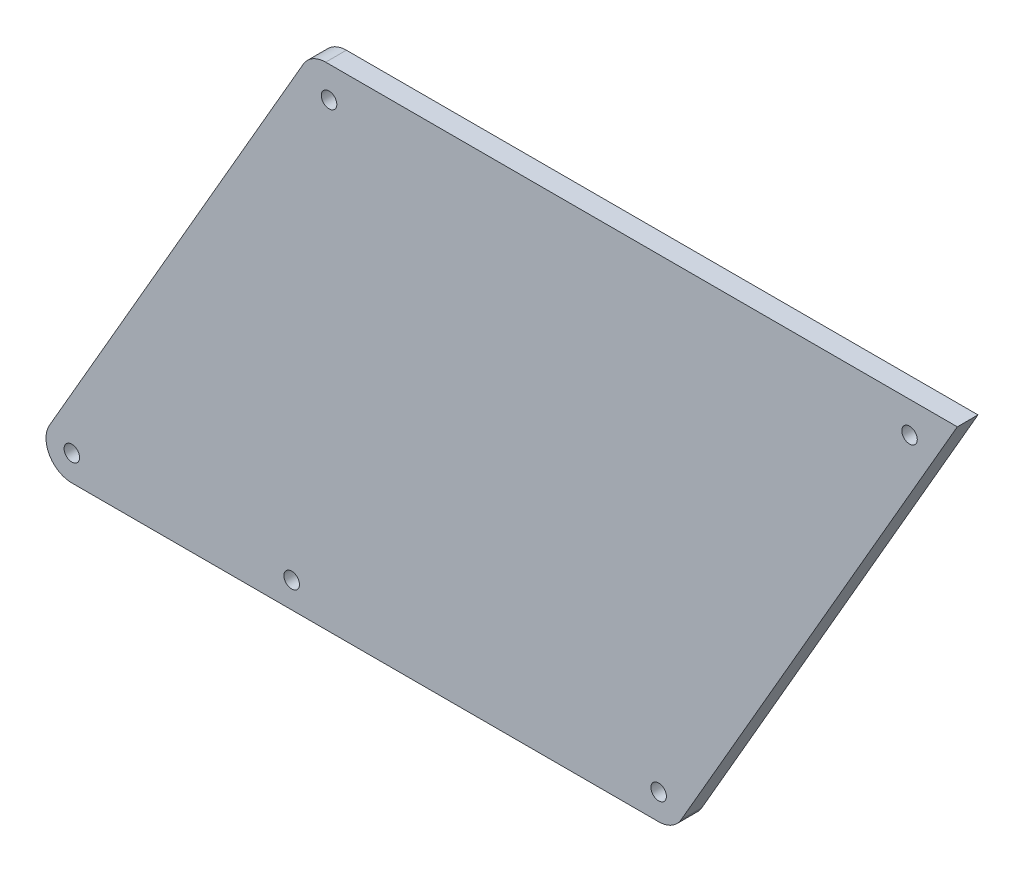
ISO-10303-21;
HEADER;
FILE_DESCRIPTION(('STEP AP214'),'2;1');
FILE_NAME('part.step','',(''),(''),'','','');
FILE_SCHEMA(('AUTOMOTIVE_DESIGN { 1 0 10303 214 1 1 1 1 }'));
ENDSEC;
DATA;
#1=APPLICATION_CONTEXT('core data for automotive mechanical design processes');
#2=APPLICATION_PROTOCOL_DEFINITION('international standard','automotive_design',2000,#1);
#3=PRODUCT_CONTEXT('',#1,'mechanical');
#4=PRODUCT('Part','Part','',(#3));
#5=PRODUCT_RELATED_PRODUCT_CATEGORY('part','',(#4));
#6=PRODUCT_DEFINITION_FORMATION('','',#4);
#7=PRODUCT_DEFINITION_CONTEXT('part definition',#1,'design');
#8=PRODUCT_DEFINITION('design','',#6,#7);
#9=PRODUCT_DEFINITION_SHAPE('','',#8);
#10=(LENGTH_UNIT() NAMED_UNIT(*) SI_UNIT(.MILLI.,.METRE.));
#11=(NAMED_UNIT(*) PLANE_ANGLE_UNIT() SI_UNIT($,.RADIAN.));
#12=(NAMED_UNIT(*) SI_UNIT($,.STERADIAN.) SOLID_ANGLE_UNIT());
#13=UNCERTAINTY_MEASURE_WITH_UNIT(LENGTH_MEASURE(1.E-05),#10,'distance_accuracy_value','');
#14=(GEOMETRIC_REPRESENTATION_CONTEXT(3) GLOBAL_UNCERTAINTY_ASSIGNED_CONTEXT((#13)) GLOBAL_UNIT_ASSIGNED_CONTEXT((#10,
#11,#12)) REPRESENTATION_CONTEXT('',''));
#15=CARTESIAN_POINT('',(0.,0.,0.));
#16=DIRECTION('',(0.,0.,1.));
#17=DIRECTION('',(1.,0.,0.));
#18=AXIS2_PLACEMENT_3D('',#15,#16,#17);
#19=CARTESIAN_POINT('',(5.77350269189623,-10.,8.));
#20=DIRECTION('',(0.,0.,-1.));
#21=DIRECTION('',(-1.,0.,0.));
#22=AXIS2_PLACEMENT_3D('',#19,#20,#21);
#23=CYLINDRICAL_SURFACE('',#22,10.);
#24=CARTESIAN_POINT('',(5.77350269189623,-10.,0.));
#25=DIRECTION('',(0.,0.,1.));
#26=DIRECTION('',(-1.,0.,0.));
#27=AXIS2_PLACEMENT_3D('',#24,#25,#26);
#28=CIRCLE('',#27,10.);
#29=CARTESIAN_POINT('',(5.77350269189623,0.,0.));
#30=VERTEX_POINT('',#29);
#31=CARTESIAN_POINT('',(-2.88675134594814,-4.99999999999996,0.));
#32=VERTEX_POINT('',#31);
#33=EDGE_CURVE('E129',#30,#32,#28,.T.);
#34=ORIENTED_EDGE('',*,*,#33,.T.);
#35=DIRECTION('',(0.,0.,-1.));
#36=VECTOR('',#35,1.);
#37=CARTESIAN_POINT('',(-2.88675134594814,-4.99999999999996,8.));
#38=LINE('',#37,#36);
#39=CARTESIAN_POINT('',(-2.88675134594814,-4.99999999999996,8.));
#40=VERTEX_POINT('',#39);
#41=EDGE_CURVE('E11',#40,#32,#38,.T.);
#42=ORIENTED_EDGE('',*,*,#41,.F.);
#43=CARTESIAN_POINT('',(5.77350269189623,-10.,8.));
#44=DIRECTION('',(0.,0.,1.));
#45=DIRECTION('',(-1.,0.,0.));
#46=AXIS2_PLACEMENT_3D('',#43,#44,#45);
#47=CIRCLE('',#46,10.);
#48=CARTESIAN_POINT('',(5.77350269189623,0.,8.));
#49=VERTEX_POINT('',#48);
#50=EDGE_CURVE('E142',#49,#40,#47,.T.);
#51=ORIENTED_EDGE('',*,*,#50,.F.);
#52=DIRECTION('',(0.,0.,-1.));
#53=VECTOR('',#52,1.);
#54=CARTESIAN_POINT('',(5.77350269189623,0.,8.));
#55=LINE('',#54,#53);
#56=EDGE_CURVE('E125',#49,#30,#55,.T.);
#57=ORIENTED_EDGE('',*,*,#56,.T.);
#58=EDGE_LOOP('',(#34,#42,#51,#57));
#59=FACE_BOUND('',#58,.T.);
#60=ADVANCED_FACE('F39',(#59),#23,.T.);
#61=CARTESIAN_POINT('',(-2.88675134594814,-4.99999999999996,8.));
#62=DIRECTION('',(0.866025403784436,-0.500000000000004,0.));
#63=DIRECTION('',(0.500000000000004,0.866025403784436,0.));
#64=AXIS2_PLACEMENT_3D('',#61,#62,#63);
#65=PLANE('',#64);
#66=DIRECTION('',(-0.500000000000004,-0.866025403784436,0.));
#67=VECTOR('',#66,1.);
#68=CARTESIAN_POINT('',(-2.88675134594814,-4.99999999999996,0.));
#69=LINE('',#68,#67);
#70=CARTESIAN_POINT('',(-101.036297108186,-175.,0.));
#71=VERTEX_POINT('',#70);
#72=EDGE_CURVE('E132',#32,#71,#69,.T.);
#73=ORIENTED_EDGE('',*,*,#72,.T.);
#74=DIRECTION('',(0.,0.,-1.));
#75=VECTOR('',#74,1.);
#76=CARTESIAN_POINT('',(-101.036297108186,-175.,8.));
#77=LINE('',#76,#75);
#78=CARTESIAN_POINT('',(-101.036297108186,-175.,8.));
#79=VERTEX_POINT('',#78);
#80=EDGE_CURVE('E47',#79,#71,#77,.T.);
#81=ORIENTED_EDGE('',*,*,#80,.F.);
#82=DIRECTION('',(-0.500000000000004,-0.866025403784436,0.));
#83=VECTOR('',#82,1.);
#84=CARTESIAN_POINT('',(-2.88675134594814,-4.99999999999996,8.));
#85=LINE('',#84,#83);
#86=EDGE_CURVE('E95',#40,#79,#85,.T.);
#87=ORIENTED_EDGE('',*,*,#86,.F.);
#88=ORIENTED_EDGE('',*,*,#41,.T.);
#89=EDGE_LOOP('',(#73,#81,#87,#88));
#90=FACE_BOUND('',#89,.T.);
#91=ADVANCED_FACE('F220',(#90),#65,.F.);
#92=CARTESIAN_POINT('',(-92.3760430703412,-180.,8.));
#93=DIRECTION('',(0.,0.,-1.));
#94=DIRECTION('',(-1.,0.,0.));
#95=AXIS2_PLACEMENT_3D('',#92,#93,#94);
#96=CYLINDRICAL_SURFACE('',#95,10.);
#97=CARTESIAN_POINT('',(-92.3760430703412,-180.,0.));
#98=DIRECTION('',(0.,0.,1.));
#99=DIRECTION('',(1.,0.,0.));
#100=AXIS2_PLACEMENT_3D('',#97,#98,#99);
#101=CIRCLE('',#100,10.);
#102=CARTESIAN_POINT('',(-92.3760430703412,-190.,0.));
#103=VERTEX_POINT('',#102);
#104=EDGE_CURVE('E135',#71,#103,#101,.T.);
#105=ORIENTED_EDGE('',*,*,#104,.T.);
#106=DIRECTION('',(0.,0.,-1.));
#107=VECTOR('',#106,1.);
#108=CARTESIAN_POINT('',(-92.3760430703412,-190.,8.));
#109=LINE('',#108,#107);
#110=CARTESIAN_POINT('',(-92.3760430703412,-190.,8.));
#111=VERTEX_POINT('',#110);
#112=EDGE_CURVE('E146',#111,#103,#109,.T.);
#113=ORIENTED_EDGE('',*,*,#112,.F.);
#114=CARTESIAN_POINT('',(-92.3760430703412,-180.,8.));
#115=DIRECTION('',(0.,0.,1.));
#116=DIRECTION('',(1.,0.,0.));
#117=AXIS2_PLACEMENT_3D('',#114,#115,#116);
#118=CIRCLE('',#117,10.);
#119=EDGE_CURVE('E154',#79,#111,#118,.T.);
#120=ORIENTED_EDGE('',*,*,#119,.F.);
#121=ORIENTED_EDGE('',*,*,#80,.T.);
#122=EDGE_LOOP('',(#105,#113,#120,#121));
#123=FACE_BOUND('',#122,.T.);
#124=ADVANCED_FACE('F152',(#123),#96,.T.);
#125=CARTESIAN_POINT('',(-92.3760430703412,-190.,8.));
#126=DIRECTION('',(0.,1.,0.));
#127=DIRECTION('',(0.,0.,1.));
#128=AXIS2_PLACEMENT_3D('',#125,#126,#127);
#129=PLANE('',#128);
#130=DIRECTION('',(1.,0.,0.));
#131=VECTOR('',#130,1.);
#132=CARTESIAN_POINT('',(-92.3760430703412,-190.,0.));
#133=LINE('',#132,#131);
#134=CARTESIAN_POINT('',(134.529946162074,-190.,0.));
#135=VERTEX_POINT('',#134);
#136=EDGE_CURVE('E137',#103,#135,#133,.T.);
#137=ORIENTED_EDGE('',*,*,#136,.T.);
#138=DIRECTION('',(0.,0.,-1.));
#139=VECTOR('',#138,1.);
#140=CARTESIAN_POINT('',(134.529946162074,-190.,8.));
#141=LINE('',#140,#139);
#142=CARTESIAN_POINT('',(134.529946162074,-190.,8.));
#143=VERTEX_POINT('',#142);
#144=EDGE_CURVE('E120',#143,#135,#141,.T.);
#145=ORIENTED_EDGE('',*,*,#144,.F.);
#146=DIRECTION('',(1.,0.,0.));
#147=VECTOR('',#146,1.);
#148=CARTESIAN_POINT('',(-92.3760430703412,-190.,8.));
#149=LINE('',#148,#147);
#150=EDGE_CURVE('E111',#111,#143,#149,.T.);
#151=ORIENTED_EDGE('',*,*,#150,.F.);
#152=ORIENTED_EDGE('',*,*,#112,.T.);
#153=EDGE_LOOP('',(#137,#145,#151,#152));
#154=FACE_BOUND('',#153,.T.);
#155=ADVANCED_FACE('F160',(#154),#129,.F.);
#156=CARTESIAN_POINT('',(134.529946162074,-180.,8.));
#157=DIRECTION('',(0.,0.,-1.));
#158=DIRECTION('',(-1.,0.,0.));
#159=AXIS2_PLACEMENT_3D('',#156,#157,#158);
#160=CYLINDRICAL_SURFACE('',#159,9.99999999999999);
#161=CARTESIAN_POINT('',(134.529946162074,-180.,0.));
#162=DIRECTION('',(0.,0.,1.));
#163=DIRECTION('',(-1.,0.,0.));
#164=AXIS2_PLACEMENT_3D('',#161,#162,#163);
#165=CIRCLE('',#164,9.99999999999999);
#166=CARTESIAN_POINT('',(143.190200199918,-185.,0.));
#167=VERTEX_POINT('',#166);
#168=EDGE_CURVE('E119',#135,#167,#165,.T.);
#169=ORIENTED_EDGE('',*,*,#168,.T.);
#170=DIRECTION('',(0.,0.,-1.));
#171=VECTOR('',#170,1.);
#172=CARTESIAN_POINT('',(143.190200199918,-185.,8.));
#173=LINE('',#172,#171);
#174=CARTESIAN_POINT('',(143.190200199918,-185.,8.));
#175=VERTEX_POINT('',#174);
#176=EDGE_CURVE('E116',#175,#167,#173,.T.);
#177=ORIENTED_EDGE('',*,*,#176,.F.);
#178=CARTESIAN_POINT('',(134.529946162074,-180.,8.));
#179=DIRECTION('',(0.,0.,1.));
#180=DIRECTION('',(-1.,0.,0.));
#181=AXIS2_PLACEMENT_3D('',#178,#179,#180);
#182=CIRCLE('',#181,9.99999999999999);
#183=EDGE_CURVE('E105',#143,#175,#182,.T.);
#184=ORIENTED_EDGE('',*,*,#183,.F.);
#185=ORIENTED_EDGE('',*,*,#144,.T.);
#186=EDGE_LOOP('',(#169,#177,#184,#185));
#187=FACE_BOUND('',#186,.T.);
#188=ADVANCED_FACE('F117',(#187),#160,.T.);
#189=CARTESIAN_POINT('',(250.,0.,8.));
#190=DIRECTION('',(-0.866025403784436,0.500000000000004,0.));
#191=DIRECTION('',(-0.500000000000004,-0.866025403784436,0.));
#192=AXIS2_PLACEMENT_3D('',#189,#190,#191);
#193=PLANE('',#192);
#194=DIRECTION('',(0.500000000000004,0.866025403784436,0.));
#195=VECTOR('',#194,1.);
#196=CARTESIAN_POINT('',(250.,0.,0.));
#197=LINE('',#196,#195);
#198=CARTESIAN_POINT('',(250.,0.,0.));
#199=VERTEX_POINT('',#198);
#200=EDGE_CURVE('E81',#167,#199,#197,.T.);
#201=ORIENTED_EDGE('',*,*,#200,.T.);
#202=DIRECTION('',(0.,0.,-1.));
#203=VECTOR('',#202,1.);
#204=CARTESIAN_POINT('',(250.,0.,8.));
#205=LINE('',#204,#203);
#206=CARTESIAN_POINT('',(250.,0.,8.));
#207=VERTEX_POINT('',#206);
#208=EDGE_CURVE('E121',#207,#199,#205,.T.);
#209=ORIENTED_EDGE('',*,*,#208,.F.);
#210=DIRECTION('',(0.500000000000004,0.866025403784436,0.));
#211=VECTOR('',#210,1.);
#212=CARTESIAN_POINT('',(250.,0.,8.));
#213=LINE('',#212,#211);
#214=EDGE_CURVE('E109',#175,#207,#213,.T.);
#215=ORIENTED_EDGE('',*,*,#214,.F.);
#216=ORIENTED_EDGE('',*,*,#176,.T.);
#217=EDGE_LOOP('',(#201,#209,#215,#216));
#218=FACE_BOUND('',#217,.T.);
#219=ADVANCED_FACE('F123',(#218),#193,.F.);
#220=CARTESIAN_POINT('',(5.77350269189623,0.,8.));
#221=DIRECTION('',(0.,-1.,0.));
#222=DIRECTION('',(0.,0.,-1.));
#223=AXIS2_PLACEMENT_3D('',#220,#221,#222);
#224=PLANE('',#223);
#225=DIRECTION('',(-1.,0.,0.));
#226=VECTOR('',#225,1.);
#227=CARTESIAN_POINT('',(5.77350269189623,0.,0.));
#228=LINE('',#227,#226);
#229=EDGE_CURVE('E87',#199,#30,#228,.T.);
#230=ORIENTED_EDGE('',*,*,#229,.T.);
#231=ORIENTED_EDGE('',*,*,#56,.F.);
#232=DIRECTION('',(-1.,0.,0.));
#233=VECTOR('',#232,1.);
#234=CARTESIAN_POINT('',(5.77350269189623,0.,8.));
#235=LINE('',#234,#233);
#236=EDGE_CURVE('E55',#207,#49,#235,.T.);
#237=ORIENTED_EDGE('',*,*,#236,.F.);
#238=ORIENTED_EDGE('',*,*,#208,.T.);
#239=EDGE_LOOP('',(#230,#231,#237,#238));
#240=FACE_BOUND('',#239,.T.);
#241=ADVANCED_FACE('F199',(#240),#224,.F.);
#242=CARTESIAN_POINT('',(5.77350269189623,-10.,8.));
#243=DIRECTION('',(0.,0.,-1.));
#244=DIRECTION('',(-1.,0.,0.));
#245=AXIS2_PLACEMENT_3D('',#242,#243,#244);
#246=PLANE('',#245);
#247=CARTESIAN_POINT('',(134.529946162074,-180.,8.));
#248=DIRECTION('',(0.,0.,1.));
#249=DIRECTION('',(1.,0.,0.));
#250=AXIS2_PLACEMENT_3D('',#247,#248,#249);
#251=CIRCLE('',#250,2.99999999999993);
#252=CARTESIAN_POINT('',(137.529946162074,-180.,8.));
#253=VERTEX_POINT('',#252);
#254=EDGE_CURVE('E174',#253,#253,#251,.T.);
#255=ORIENTED_EDGE('',*,*,#254,.F.);
#256=EDGE_LOOP('',(#255));
#257=FACE_BOUND('',#256,.T.);
#258=CARTESIAN_POINT('',(231.524791385931,-11.9999999999999,8.));
#259=DIRECTION('',(0.,0.,1.));
#260=DIRECTION('',(1.,0.,0.));
#261=AXIS2_PLACEMENT_3D('',#258,#259,#260);
#262=CIRCLE('',#261,2.99999999999994);
#263=CARTESIAN_POINT('',(234.524791385931,-11.9999999999999,8.));
#264=VERTEX_POINT('',#263);
#265=EDGE_CURVE('E180',#264,#264,#262,.T.);
#266=ORIENTED_EDGE('',*,*,#265,.F.);
#267=EDGE_LOOP('',(#266));
#268=FACE_BOUND('',#267,.T.);
#269=CARTESIAN_POINT('',(-92.3760430703346,-180.000000000013,8.));
#270=DIRECTION('',(0.,0.,1.));
#271=DIRECTION('',(1.,0.,0.));
#272=AXIS2_PLACEMENT_3D('',#269,#270,#271);
#273=CIRCLE('',#272,2.99999999999993);
#274=CARTESIAN_POINT('',(-89.3760430703347,-180.000000000013,8.));
#275=VERTEX_POINT('',#274);
#276=EDGE_CURVE('E186',#275,#275,#273,.T.);
#277=ORIENTED_EDGE('',*,*,#276,.F.);
#278=EDGE_LOOP('',(#277));
#279=FACE_BOUND('',#278,.T.);
#280=CARTESIAN_POINT('',(7.07179676972447,-11.9999999999999,8.));
#281=DIRECTION('',(0.,0.,1.));
#282=DIRECTION('',(1.,0.,0.));
#283=AXIS2_PLACEMENT_3D('',#280,#281,#282);
#284=CIRCLE('',#283,2.99999999999994);
#285=CARTESIAN_POINT('',(10.0717967697244,-11.9999999999999,8.));
#286=VERTEX_POINT('',#285);
#287=EDGE_CURVE('E168',#286,#286,#284,.T.);
#288=ORIENTED_EDGE('',*,*,#287,.F.);
#289=EDGE_LOOP('',(#288));
#290=FACE_BOUND('',#289,.T.);
#291=CARTESIAN_POINT('',(-7.37604307033468,-180.000000000013,8.));
#292=DIRECTION('',(0.,0.,1.));
#293=DIRECTION('',(1.,0.,0.));
#294=AXIS2_PLACEMENT_3D('',#291,#292,#293);
#295=CIRCLE('',#294,2.99999999999993);
#296=CARTESIAN_POINT('',(-4.37604307033476,-180.000000000013,8.));
#297=VERTEX_POINT('',#296);
#298=EDGE_CURVE('E165',#297,#297,#295,.T.);
#299=ORIENTED_EDGE('',*,*,#298,.F.);
#300=EDGE_LOOP('',(#299));
#301=FACE_BOUND('',#300,.T.);
#302=ORIENTED_EDGE('',*,*,#50,.T.);
#303=ORIENTED_EDGE('',*,*,#86,.T.);
#304=ORIENTED_EDGE('',*,*,#119,.T.);
#305=ORIENTED_EDGE('',*,*,#150,.T.);
#306=ORIENTED_EDGE('',*,*,#183,.T.);
#307=ORIENTED_EDGE('',*,*,#214,.T.);
#308=ORIENTED_EDGE('',*,*,#236,.T.);
#309=EDGE_LOOP('',(#302,#303,#304,#305,#306,#307,#308));
#310=FACE_BOUND('',#309,.T.);
#311=ADVANCED_FACE('F107',(#257,#268,#279,#290,#301,#310),#246,.F.);
#312=CARTESIAN_POINT('',(5.77350269189623,-10.,0.));
#313=DIRECTION('',(0.,0.,-1.));
#314=DIRECTION('',(-1.,0.,0.));
#315=AXIS2_PLACEMENT_3D('',#312,#313,#314);
#316=PLANE('',#315);
#317=CARTESIAN_POINT('',(134.529946162074,-180.,0.));
#318=DIRECTION('',(0.,0.,1.));
#319=DIRECTION('',(1.,0.,0.));
#320=AXIS2_PLACEMENT_3D('',#317,#318,#319);
#321=CIRCLE('',#320,2.99999999999993);
#322=CARTESIAN_POINT('',(137.529946162074,-180.,0.));
#323=VERTEX_POINT('',#322);
#324=EDGE_CURVE('E171',#323,#323,#321,.T.);
#325=ORIENTED_EDGE('',*,*,#324,.T.);
#326=EDGE_LOOP('',(#325));
#327=FACE_BOUND('',#326,.T.);
#328=CARTESIAN_POINT('',(231.524791385931,-11.9999999999999,0.));
#329=DIRECTION('',(0.,0.,1.));
#330=DIRECTION('',(1.,0.,0.));
#331=AXIS2_PLACEMENT_3D('',#328,#329,#330);
#332=CIRCLE('',#331,2.99999999999994);
#333=CARTESIAN_POINT('',(234.524791385931,-11.9999999999999,0.));
#334=VERTEX_POINT('',#333);
#335=EDGE_CURVE('E177',#334,#334,#332,.T.);
#336=ORIENTED_EDGE('',*,*,#335,.T.);
#337=EDGE_LOOP('',(#336));
#338=FACE_BOUND('',#337,.T.);
#339=CARTESIAN_POINT('',(-92.3760430703346,-180.000000000013,0.));
#340=DIRECTION('',(0.,0.,1.));
#341=DIRECTION('',(1.,0.,0.));
#342=AXIS2_PLACEMENT_3D('',#339,#340,#341);
#343=CIRCLE('',#342,2.99999999999993);
#344=CARTESIAN_POINT('',(-89.3760430703347,-180.000000000013,0.));
#345=VERTEX_POINT('',#344);
#346=EDGE_CURVE('E183',#345,#345,#343,.T.);
#347=ORIENTED_EDGE('',*,*,#346,.T.);
#348=EDGE_LOOP('',(#347));
#349=FACE_BOUND('',#348,.T.);
#350=CARTESIAN_POINT('',(7.07179676972447,-11.9999999999999,0.));
#351=DIRECTION('',(0.,0.,1.));
#352=DIRECTION('',(1.,0.,0.));
#353=AXIS2_PLACEMENT_3D('',#350,#351,#352);
#354=CIRCLE('',#353,2.99999999999994);
#355=CARTESIAN_POINT('',(10.0717967697244,-11.9999999999999,0.));
#356=VERTEX_POINT('',#355);
#357=EDGE_CURVE('E189',#356,#356,#354,.T.);
#358=ORIENTED_EDGE('',*,*,#357,.T.);
#359=EDGE_LOOP('',(#358));
#360=FACE_BOUND('',#359,.T.);
#361=CARTESIAN_POINT('',(-7.37604307033468,-180.000000000013,0.));
#362=DIRECTION('',(0.,0.,1.));
#363=DIRECTION('',(1.,0.,0.));
#364=AXIS2_PLACEMENT_3D('',#361,#362,#363);
#365=CIRCLE('',#364,2.99999999999993);
#366=CARTESIAN_POINT('',(-4.37604307033476,-180.000000000013,0.));
#367=VERTEX_POINT('',#366);
#368=EDGE_CURVE('E133',#367,#367,#365,.T.);
#369=ORIENTED_EDGE('',*,*,#368,.T.);
#370=EDGE_LOOP('',(#369));
#371=FACE_BOUND('',#370,.T.);
#372=ORIENTED_EDGE('',*,*,#33,.F.);
#373=ORIENTED_EDGE('',*,*,#229,.F.);
#374=ORIENTED_EDGE('',*,*,#200,.F.);
#375=ORIENTED_EDGE('',*,*,#168,.F.);
#376=ORIENTED_EDGE('',*,*,#136,.F.);
#377=ORIENTED_EDGE('',*,*,#104,.F.);
#378=ORIENTED_EDGE('',*,*,#72,.F.);
#379=EDGE_LOOP('',(#372,#373,#374,#375,#376,#377,#378));
#380=FACE_BOUND('',#379,.T.);
#381=ADVANCED_FACE('F158',(#327,#338,#349,#360,#371,#380),#316,.T.);
#382=CARTESIAN_POINT('',(-7.37604307033468,-180.000000000013,0.));
#383=DIRECTION('',(0.,0.,1.));
#384=DIRECTION('',(1.,0.,0.));
#385=AXIS2_PLACEMENT_3D('',#382,#383,#384);
#386=CYLINDRICAL_SURFACE('',#385,2.99999999999993);
#387=ORIENTED_EDGE('',*,*,#368,.F.);
#388=EDGE_LOOP('',(#387));
#389=FACE_BOUND('',#388,.T.);
#390=ORIENTED_EDGE('',*,*,#298,.T.);
#391=EDGE_LOOP('',(#390));
#392=FACE_BOUND('',#391,.T.);
#393=ADVANCED_FACE('F204',(#389,#392),#386,.F.);
#394=CARTESIAN_POINT('',(7.07179676972447,-11.9999999999999,0.));
#395=DIRECTION('',(0.,0.,1.));
#396=DIRECTION('',(1.,0.,0.));
#397=AXIS2_PLACEMENT_3D('',#394,#395,#396);
#398=CYLINDRICAL_SURFACE('',#397,2.99999999999994);
#399=ORIENTED_EDGE('',*,*,#357,.F.);
#400=EDGE_LOOP('',(#399));
#401=FACE_BOUND('',#400,.T.);
#402=ORIENTED_EDGE('',*,*,#287,.T.);
#403=EDGE_LOOP('',(#402));
#404=FACE_BOUND('',#403,.T.);
#405=ADVANCED_FACE('F195',(#401,#404),#398,.F.);
#406=CARTESIAN_POINT('',(-92.3760430703346,-180.000000000013,0.));
#407=DIRECTION('',(0.,0.,1.));
#408=DIRECTION('',(1.,0.,0.));
#409=AXIS2_PLACEMENT_3D('',#406,#407,#408);
#410=CYLINDRICAL_SURFACE('',#409,2.99999999999993);
#411=ORIENTED_EDGE('',*,*,#346,.F.);
#412=EDGE_LOOP('',(#411));
#413=FACE_BOUND('',#412,.T.);
#414=ORIENTED_EDGE('',*,*,#276,.T.);
#415=EDGE_LOOP('',(#414));
#416=FACE_BOUND('',#415,.T.);
#417=ADVANCED_FACE('F212',(#413,#416),#410,.F.);
#418=CARTESIAN_POINT('',(231.524791385931,-11.9999999999999,0.));
#419=DIRECTION('',(0.,0.,1.));
#420=DIRECTION('',(1.,0.,0.));
#421=AXIS2_PLACEMENT_3D('',#418,#419,#420);
#422=CYLINDRICAL_SURFACE('',#421,2.99999999999994);
#423=ORIENTED_EDGE('',*,*,#335,.F.);
#424=EDGE_LOOP('',(#423));
#425=FACE_BOUND('',#424,.T.);
#426=ORIENTED_EDGE('',*,*,#265,.T.);
#427=EDGE_LOOP('',(#426));
#428=FACE_BOUND('',#427,.T.);
#429=ADVANCED_FACE('F296',(#425,#428),#422,.F.);
#430=CARTESIAN_POINT('',(134.529946162074,-180.,0.));
#431=DIRECTION('',(0.,0.,1.));
#432=DIRECTION('',(1.,0.,0.));
#433=AXIS2_PLACEMENT_3D('',#430,#431,#432);
#434=CYLINDRICAL_SURFACE('',#433,2.99999999999993);
#435=ORIENTED_EDGE('',*,*,#324,.F.);
#436=EDGE_LOOP('',(#435));
#437=FACE_BOUND('',#436,.T.);
#438=ORIENTED_EDGE('',*,*,#254,.T.);
#439=EDGE_LOOP('',(#438));
#440=FACE_BOUND('',#439,.T.);
#441=ADVANCED_FACE('F307',(#437,#440),#434,.F.);
#442=CLOSED_SHELL('',(#60,#91,#124,#155,#188,#219,#241,#311,#381,#393,#405,#417,#429,#441));
#443=MANIFOLD_SOLID_BREP('B2',#442);
#444=ADVANCED_BREP_SHAPE_REPRESENTATION('',(#18,#443),#14);
#445=SHAPE_DEFINITION_REPRESENTATION(#9,#444);
ENDSEC;
END-ISO-10303-21;
